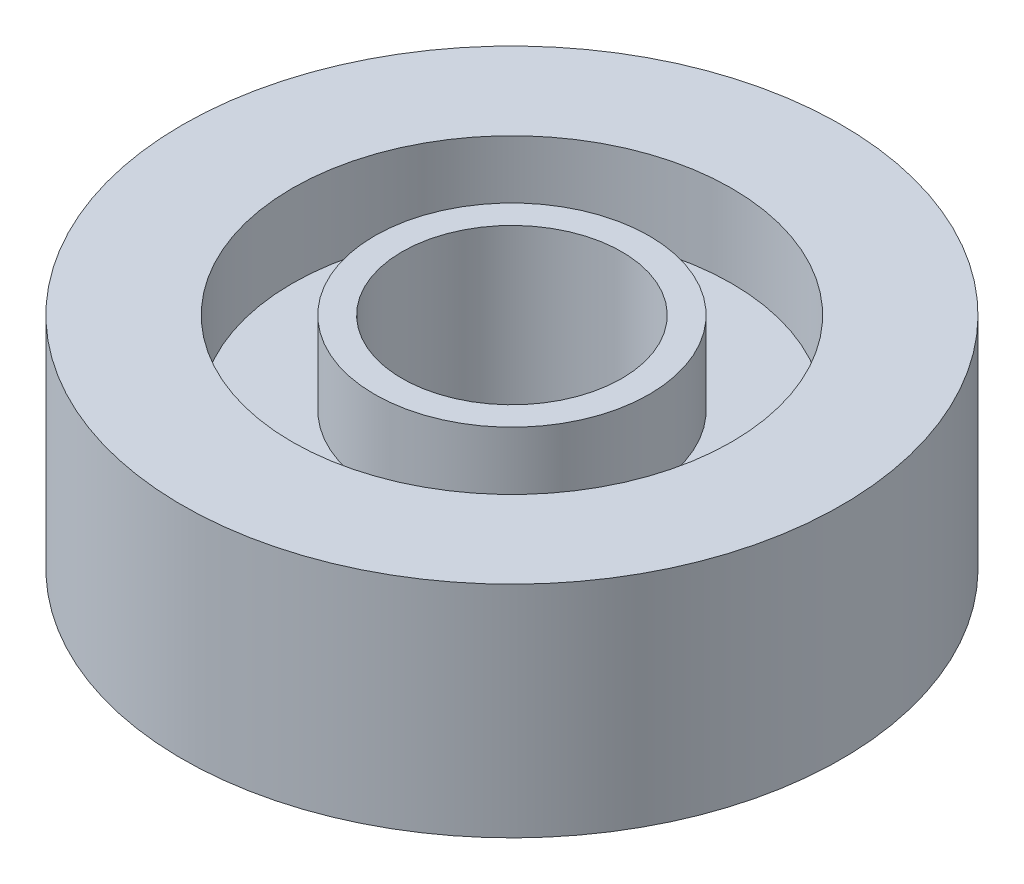
ISO-10303-21;
HEADER;
FILE_DESCRIPTION(('STEP AP214'),'2;1');
FILE_NAME('part.step','',(''),(''),'','','');
FILE_SCHEMA(('AUTOMOTIVE_DESIGN { 1 0 10303 214 1 1 1 1 }'));
ENDSEC;
DATA;
#1=APPLICATION_CONTEXT('core data for automotive mechanical design processes');
#2=APPLICATION_PROTOCOL_DEFINITION('international standard','automotive_design',2000,#1);
#3=PRODUCT_CONTEXT('',#1,'mechanical');
#4=PRODUCT('Part','Part','',(#3));
#5=PRODUCT_RELATED_PRODUCT_CATEGORY('part','',(#4));
#6=PRODUCT_DEFINITION_FORMATION('','',#4);
#7=PRODUCT_DEFINITION_CONTEXT('part definition',#1,'design');
#8=PRODUCT_DEFINITION('design','',#6,#7);
#9=PRODUCT_DEFINITION_SHAPE('','',#8);
#10=(LENGTH_UNIT() NAMED_UNIT(*) SI_UNIT(.MILLI.,.METRE.));
#11=(NAMED_UNIT(*) PLANE_ANGLE_UNIT() SI_UNIT($,.RADIAN.));
#12=(NAMED_UNIT(*) SI_UNIT($,.STERADIAN.) SOLID_ANGLE_UNIT());
#13=UNCERTAINTY_MEASURE_WITH_UNIT(LENGTH_MEASURE(1.E-05),#10,'distance_accuracy_value','');
#14=(GEOMETRIC_REPRESENTATION_CONTEXT(3) GLOBAL_UNCERTAINTY_ASSIGNED_CONTEXT((#13)) GLOBAL_UNIT_ASSIGNED_CONTEXT((#10,
#11,#12)) REPRESENTATION_CONTEXT('',''));
#15=CARTESIAN_POINT('',(0.,0.,0.));
#16=DIRECTION('',(0.,0.,1.));
#17=DIRECTION('',(1.,0.,0.));
#18=AXIS2_PLACEMENT_3D('',#15,#16,#17);
#19=CARTESIAN_POINT('',(-2.89725742186397,6.36964267959614,0.));
#20=DIRECTION('',(0.,1.,0.));
#21=DIRECTION('',(-1.,0.,0.));
#22=AXIS2_PLACEMENT_3D('',#19,#20,#21);
#23=CYLINDRICAL_SURFACE('',#22,4.);
#24=CARTESIAN_POINT('',(-2.89725742186397,-4.,0.));
#25=DIRECTION('',(0.,1.,0.));
#26=DIRECTION('',(-1.,0.,0.));
#27=AXIS2_PLACEMENT_3D('',#24,#25,#26);
#28=CIRCLE('',#27,4.);
#29=CARTESIAN_POINT('',(-6.89725742186397,-4.,0.));
#30=VERTEX_POINT('',#29);
#31=EDGE_CURVE('E10',#30,#30,#28,.T.);
#32=ORIENTED_EDGE('',*,*,#31,.F.);
#33=EDGE_LOOP('',(#32));
#34=FACE_BOUND('',#33,.T.);
#35=CARTESIAN_POINT('',(-2.89725742186397,4.,0.));
#36=DIRECTION('',(0.,1.,0.));
#37=DIRECTION('',(-1.,0.,0.));
#38=AXIS2_PLACEMENT_3D('',#35,#36,#37);
#39=CIRCLE('',#38,4.);
#40=CARTESIAN_POINT('',(-6.89725742186397,4.,0.));
#41=VERTEX_POINT('',#40);
#42=EDGE_CURVE('E71',#41,#41,#39,.T.);
#43=ORIENTED_EDGE('',*,*,#42,.T.);
#44=EDGE_LOOP('',(#43));
#45=FACE_BOUND('',#44,.T.);
#46=ADVANCED_FACE('F31',(#34,#45),#23,.F.);
#47=CARTESIAN_POINT('',(1.10274257813603,-4.,0.));
#48=DIRECTION('',(0.,1.,0.));
#49=DIRECTION('',(-1.,0.,0.));
#50=AXIS2_PLACEMENT_3D('',#47,#48,#49);
#51=PLANE('',#50);
#52=CARTESIAN_POINT('',(-2.89725742186397,-4.,0.));
#53=DIRECTION('',(0.,1.,0.));
#54=DIRECTION('',(-1.,0.,0.));
#55=AXIS2_PLACEMENT_3D('',#52,#53,#54);
#56=CIRCLE('',#55,5.);
#57=CARTESIAN_POINT('',(-7.89725742186397,-4.,0.));
#58=VERTEX_POINT('',#57);
#59=EDGE_CURVE('E37',#58,#58,#56,.T.);
#60=ORIENTED_EDGE('',*,*,#59,.F.);
#61=EDGE_LOOP('',(#60));
#62=FACE_BOUND('',#61,.T.);
#63=ORIENTED_EDGE('',*,*,#31,.T.);
#64=EDGE_LOOP('',(#63));
#65=FACE_BOUND('',#64,.T.);
#66=ADVANCED_FACE('F132',(#62,#65),#51,.F.);
#67=CARTESIAN_POINT('',(-2.89725742186397,6.36964267959614,0.));
#68=DIRECTION('',(0.,1.,0.));
#69=DIRECTION('',(-1.,0.,0.));
#70=AXIS2_PLACEMENT_3D('',#67,#68,#69);
#71=CYLINDRICAL_SURFACE('',#70,5.);
#72=CARTESIAN_POINT('',(-2.89725742186397,-1.,0.));
#73=DIRECTION('',(0.,1.,0.));
#74=DIRECTION('',(-1.,0.,0.));
#75=AXIS2_PLACEMENT_3D('',#72,#73,#74);
#76=CIRCLE('',#75,5.);
#77=CARTESIAN_POINT('',(-7.89725742186397,-1.,0.));
#78=VERTEX_POINT('',#77);
#79=EDGE_CURVE('E41',#78,#78,#76,.T.);
#80=ORIENTED_EDGE('',*,*,#79,.F.);
#81=EDGE_LOOP('',(#80));
#82=FACE_BOUND('',#81,.T.);
#83=ORIENTED_EDGE('',*,*,#59,.T.);
#84=EDGE_LOOP('',(#83));
#85=FACE_BOUND('',#84,.T.);
#86=ADVANCED_FACE('F127',(#82,#85),#71,.T.);
#87=CARTESIAN_POINT('',(2.10274257813603,-1.,0.));
#88=DIRECTION('',(0.,1.,0.));
#89=DIRECTION('',(-1.,0.,0.));
#90=AXIS2_PLACEMENT_3D('',#87,#88,#89);
#91=PLANE('',#90);
#92=CARTESIAN_POINT('',(-2.89725742186397,-1.,0.));
#93=DIRECTION('',(0.,1.,0.));
#94=DIRECTION('',(-1.,0.,0.));
#95=AXIS2_PLACEMENT_3D('',#92,#93,#94);
#96=CIRCLE('',#95,8.);
#97=CARTESIAN_POINT('',(-10.897257421864,-1.,0.));
#98=VERTEX_POINT('',#97);
#99=EDGE_CURVE('E45',#98,#98,#96,.T.);
#100=ORIENTED_EDGE('',*,*,#99,.F.);
#101=EDGE_LOOP('',(#100));
#102=FACE_BOUND('',#101,.T.);
#103=ORIENTED_EDGE('',*,*,#79,.T.);
#104=EDGE_LOOP('',(#103));
#105=FACE_BOUND('',#104,.T.);
#106=ADVANCED_FACE('F121',(#102,#105),#91,.F.);
#107=CARTESIAN_POINT('',(-2.89725742186397,6.36964267959614,0.));
#108=DIRECTION('',(0.,1.,0.));
#109=DIRECTION('',(-1.,0.,0.));
#110=AXIS2_PLACEMENT_3D('',#107,#108,#109);
#111=CYLINDRICAL_SURFACE('',#110,8.);
#112=CARTESIAN_POINT('',(-2.89725742186397,-4.,0.));
#113=DIRECTION('',(0.,1.,0.));
#114=DIRECTION('',(-1.,0.,0.));
#115=AXIS2_PLACEMENT_3D('',#112,#113,#114);
#116=CIRCLE('',#115,8.);
#117=CARTESIAN_POINT('',(-10.897257421864,-4.,0.));
#118=VERTEX_POINT('',#117);
#119=EDGE_CURVE('E50',#118,#118,#116,.T.);
#120=ORIENTED_EDGE('',*,*,#119,.F.);
#121=EDGE_LOOP('',(#120));
#122=FACE_BOUND('',#121,.T.);
#123=ORIENTED_EDGE('',*,*,#99,.T.);
#124=EDGE_LOOP('',(#123));
#125=FACE_BOUND('',#124,.T.);
#126=ADVANCED_FACE('F115',(#122,#125),#111,.F.);
#127=CARTESIAN_POINT('',(5.10274257813603,-4.,0.));
#128=DIRECTION('',(0.,1.,0.));
#129=DIRECTION('',(-1.,0.,0.));
#130=AXIS2_PLACEMENT_3D('',#127,#128,#129);
#131=PLANE('',#130);
#132=CARTESIAN_POINT('',(-2.89725742186397,-4.,0.));
#133=DIRECTION('',(0.,1.,0.));
#134=DIRECTION('',(-1.,0.,0.));
#135=AXIS2_PLACEMENT_3D('',#132,#133,#134);
#136=CIRCLE('',#135,12.);
#137=CARTESIAN_POINT('',(-14.897257421864,-4.,0.));
#138=VERTEX_POINT('',#137);
#139=EDGE_CURVE('E53',#138,#138,#136,.T.);
#140=ORIENTED_EDGE('',*,*,#139,.F.);
#141=EDGE_LOOP('',(#140));
#142=FACE_BOUND('',#141,.T.);
#143=ORIENTED_EDGE('',*,*,#119,.T.);
#144=EDGE_LOOP('',(#143));
#145=FACE_BOUND('',#144,.T.);
#146=ADVANCED_FACE('F109',(#142,#145),#131,.F.);
#147=CARTESIAN_POINT('',(-2.89725742186397,6.36964267959614,0.));
#148=DIRECTION('',(0.,1.,0.));
#149=DIRECTION('',(-1.,0.,0.));
#150=AXIS2_PLACEMENT_3D('',#147,#148,#149);
#151=CYLINDRICAL_SURFACE('',#150,12.);
#152=CARTESIAN_POINT('',(-2.89725742186397,4.,0.));
#153=DIRECTION('',(0.,1.,0.));
#154=DIRECTION('',(-1.,0.,0.));
#155=AXIS2_PLACEMENT_3D('',#152,#153,#154);
#156=CIRCLE('',#155,12.);
#157=CARTESIAN_POINT('',(-14.897257421864,4.,0.));
#158=VERTEX_POINT('',#157);
#159=EDGE_CURVE('E56',#158,#158,#156,.T.);
#160=ORIENTED_EDGE('',*,*,#159,.F.);
#161=EDGE_LOOP('',(#160));
#162=FACE_BOUND('',#161,.T.);
#163=ORIENTED_EDGE('',*,*,#139,.T.);
#164=EDGE_LOOP('',(#163));
#165=FACE_BOUND('',#164,.T.);
#166=ADVANCED_FACE('F103',(#162,#165),#151,.T.);
#167=CARTESIAN_POINT('',(9.10274257813603,4.,0.));
#168=DIRECTION('',(0.,-1.,0.));
#169=DIRECTION('',(1.,0.,0.));
#170=AXIS2_PLACEMENT_3D('',#167,#168,#169);
#171=PLANE('',#170);
#172=CARTESIAN_POINT('',(-2.89725742186397,4.,0.));
#173=DIRECTION('',(0.,1.,0.));
#174=DIRECTION('',(-1.,0.,0.));
#175=AXIS2_PLACEMENT_3D('',#172,#173,#174);
#176=CIRCLE('',#175,8.);
#177=CARTESIAN_POINT('',(-10.897257421864,4.,0.));
#178=VERTEX_POINT('',#177);
#179=EDGE_CURVE('E59',#178,#178,#176,.T.);
#180=ORIENTED_EDGE('',*,*,#179,.F.);
#181=EDGE_LOOP('',(#180));
#182=FACE_BOUND('',#181,.T.);
#183=ORIENTED_EDGE('',*,*,#159,.T.);
#184=EDGE_LOOP('',(#183));
#185=FACE_BOUND('',#184,.T.);
#186=ADVANCED_FACE('F97',(#182,#185),#171,.F.);
#187=CARTESIAN_POINT('',(-2.89725742186397,6.36964267959614,0.));
#188=DIRECTION('',(0.,1.,0.));
#189=DIRECTION('',(-1.,0.,0.));
#190=AXIS2_PLACEMENT_3D('',#187,#188,#189);
#191=CYLINDRICAL_SURFACE('',#190,8.);
#192=CARTESIAN_POINT('',(-2.89725742186397,0.999999999999999,0.));
#193=DIRECTION('',(0.,1.,0.));
#194=DIRECTION('',(-1.,0.,0.));
#195=AXIS2_PLACEMENT_3D('',#192,#193,#194);
#196=CIRCLE('',#195,8.);
#197=CARTESIAN_POINT('',(-10.897257421864,0.999999999999998,0.));
#198=VERTEX_POINT('',#197);
#199=EDGE_CURVE('E62',#198,#198,#196,.T.);
#200=ORIENTED_EDGE('',*,*,#199,.F.);
#201=EDGE_LOOP('',(#200));
#202=FACE_BOUND('',#201,.T.);
#203=ORIENTED_EDGE('',*,*,#179,.T.);
#204=EDGE_LOOP('',(#203));
#205=FACE_BOUND('',#204,.T.);
#206=ADVANCED_FACE('F91',(#202,#205),#191,.F.);
#207=CARTESIAN_POINT('',(2.10274257813603,1.,0.));
#208=DIRECTION('',(0.,-1.,0.));
#209=DIRECTION('',(1.,0.,0.));
#210=AXIS2_PLACEMENT_3D('',#207,#208,#209);
#211=PLANE('',#210);
#212=CARTESIAN_POINT('',(-2.89725742186397,0.999999999999999,0.));
#213=DIRECTION('',(0.,1.,0.));
#214=DIRECTION('',(-1.,0.,0.));
#215=AXIS2_PLACEMENT_3D('',#212,#213,#214);
#216=CIRCLE('',#215,5.);
#217=CARTESIAN_POINT('',(-7.89725742186397,0.999999999999999,0.));
#218=VERTEX_POINT('',#217);
#219=EDGE_CURVE('E65',#218,#218,#216,.T.);
#220=ORIENTED_EDGE('',*,*,#219,.F.);
#221=EDGE_LOOP('',(#220));
#222=FACE_BOUND('',#221,.T.);
#223=ORIENTED_EDGE('',*,*,#199,.T.);
#224=EDGE_LOOP('',(#223));
#225=FACE_BOUND('',#224,.T.);
#226=ADVANCED_FACE('F85',(#222,#225),#211,.F.);
#227=CARTESIAN_POINT('',(-2.89725742186397,6.36964267959614,0.));
#228=DIRECTION('',(0.,1.,0.));
#229=DIRECTION('',(-1.,0.,0.));
#230=AXIS2_PLACEMENT_3D('',#227,#228,#229);
#231=CYLINDRICAL_SURFACE('',#230,5.);
#232=CARTESIAN_POINT('',(-2.89725742186397,4.,0.));
#233=DIRECTION('',(0.,1.,0.));
#234=DIRECTION('',(-1.,0.,0.));
#235=AXIS2_PLACEMENT_3D('',#232,#233,#234);
#236=CIRCLE('',#235,5.);
#237=CARTESIAN_POINT('',(-7.89725742186397,4.,0.));
#238=VERTEX_POINT('',#237);
#239=EDGE_CURVE('E68',#238,#238,#236,.T.);
#240=ORIENTED_EDGE('',*,*,#239,.F.);
#241=EDGE_LOOP('',(#240));
#242=FACE_BOUND('',#241,.T.);
#243=ORIENTED_EDGE('',*,*,#219,.T.);
#244=EDGE_LOOP('',(#243));
#245=FACE_BOUND('',#244,.T.);
#246=ADVANCED_FACE('F79',(#242,#245),#231,.T.);
#247=CARTESIAN_POINT('',(2.10274257813603,4.,0.));
#248=DIRECTION('',(0.,-1.,0.));
#249=DIRECTION('',(1.,0.,0.));
#250=AXIS2_PLACEMENT_3D('',#247,#248,#249);
#251=PLANE('',#250);
#252=ORIENTED_EDGE('',*,*,#42,.F.);
#253=EDGE_LOOP('',(#252));
#254=FACE_BOUND('',#253,.T.);
#255=ORIENTED_EDGE('',*,*,#239,.T.);
#256=EDGE_LOOP('',(#255));
#257=FACE_BOUND('',#256,.T.);
#258=ADVANCED_FACE('F76',(#254,#257),#251,.F.);
#259=CLOSED_SHELL('',(#46,#66,#86,#106,#126,#146,#166,#186,#206,#226,#246,#258));
#260=MANIFOLD_SOLID_BREP('B2',#259);
#261=ADVANCED_BREP_SHAPE_REPRESENTATION('',(#18,#260),#14);
#262=SHAPE_DEFINITION_REPRESENTATION(#9,#261);
ENDSEC;
END-ISO-10303-21;
